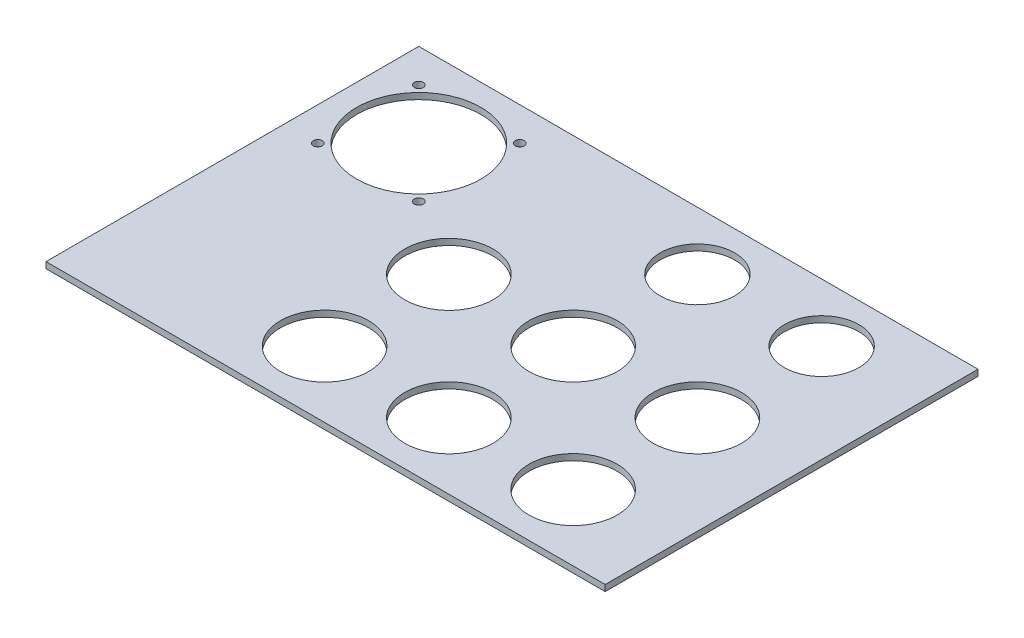
ISO-10303-21;
HEADER;
FILE_DESCRIPTION(('STEP AP214'),'2;1');
FILE_NAME('part.step','',(''),(''),'','','');
FILE_SCHEMA(('AUTOMOTIVE_DESIGN { 1 0 10303 214 1 1 1 1 }'));
ENDSEC;
DATA;
#1=APPLICATION_CONTEXT('core data for automotive mechanical design processes');
#2=APPLICATION_PROTOCOL_DEFINITION('international standard','automotive_design',2000,#1);
#3=PRODUCT_CONTEXT('',#1,'mechanical');
#4=PRODUCT('Part','Part','',(#3));
#5=PRODUCT_RELATED_PRODUCT_CATEGORY('part','',(#4));
#6=PRODUCT_DEFINITION_FORMATION('','',#4);
#7=PRODUCT_DEFINITION_CONTEXT('part definition',#1,'design');
#8=PRODUCT_DEFINITION('design','',#6,#7);
#9=PRODUCT_DEFINITION_SHAPE('','',#8);
#10=(LENGTH_UNIT() NAMED_UNIT(*) SI_UNIT(.MILLI.,.METRE.));
#11=(NAMED_UNIT(*) PLANE_ANGLE_UNIT() SI_UNIT($,.RADIAN.));
#12=(NAMED_UNIT(*) SI_UNIT($,.STERADIAN.) SOLID_ANGLE_UNIT());
#13=UNCERTAINTY_MEASURE_WITH_UNIT(LENGTH_MEASURE(1.E-05),#10,'distance_accuracy_value','');
#14=(GEOMETRIC_REPRESENTATION_CONTEXT(3) GLOBAL_UNCERTAINTY_ASSIGNED_CONTEXT((#13)) GLOBAL_UNIT_ASSIGNED_CONTEXT((#10,
#11,#12)) REPRESENTATION_CONTEXT('',''));
#15=CARTESIAN_POINT('',(0.,0.,0.));
#16=DIRECTION('',(0.,0.,1.));
#17=DIRECTION('',(1.,0.,0.));
#18=AXIS2_PLACEMENT_3D('',#15,#16,#17);
#19=CARTESIAN_POINT('',(-118.728476821192,2.,-78.6754966887417));
#20=DIRECTION('',(1.,0.,0.));
#21=DIRECTION('',(0.,0.,-1.));
#22=AXIS2_PLACEMENT_3D('',#19,#20,#21);
#23=PLANE('',#22);
#24=DIRECTION('',(0.,0.,1.));
#25=VECTOR('',#24,1.);
#26=CARTESIAN_POINT('',(-118.728476821192,0.,-78.6754966887417));
#27=LINE('',#26,#25);
#28=CARTESIAN_POINT('',(-118.728476821192,0.,-78.6754966887417));
#29=VERTEX_POINT('',#28);
#30=CARTESIAN_POINT('',(-118.728476821192,0.,41.3245033112583));
#31=VERTEX_POINT('',#30);
#32=EDGE_CURVE('E102',#29,#31,#27,.T.);
#33=ORIENTED_EDGE('',*,*,#32,.T.);
#34=DIRECTION('',(0.,-1.,0.));
#35=VECTOR('',#34,1.);
#36=CARTESIAN_POINT('',(-118.728476821192,2.,41.3245033112583));
#37=LINE('',#36,#35);
#38=CARTESIAN_POINT('',(-118.728476821192,2.,41.3245033112583));
#39=VERTEX_POINT('',#38);
#40=EDGE_CURVE('E11',#39,#31,#37,.T.);
#41=ORIENTED_EDGE('',*,*,#40,.F.);
#42=DIRECTION('',(0.,0.,1.));
#43=VECTOR('',#42,1.);
#44=CARTESIAN_POINT('',(-118.728476821192,2.,-78.6754966887417));
#45=LINE('',#44,#43);
#46=CARTESIAN_POINT('',(-118.728476821192,2.,-78.6754966887417));
#47=VERTEX_POINT('',#46);
#48=EDGE_CURVE('E90',#47,#39,#45,.T.);
#49=ORIENTED_EDGE('',*,*,#48,.F.);
#50=DIRECTION('',(0.,-1.,0.));
#51=VECTOR('',#50,1.);
#52=CARTESIAN_POINT('',(-118.728476821192,2.,-78.6754966887417));
#53=LINE('',#52,#51);
#54=EDGE_CURVE('E98',#47,#29,#53,.T.);
#55=ORIENTED_EDGE('',*,*,#54,.T.);
#56=EDGE_LOOP('',(#33,#41,#49,#55));
#57=FACE_BOUND('',#56,.T.);
#58=ADVANCED_FACE('F39',(#57),#23,.F.);
#59=CARTESIAN_POINT('',(-118.728476821192,2.,41.3245033112583));
#60=DIRECTION('',(0.,0.,-1.));
#61=DIRECTION('',(-1.,0.,0.));
#62=AXIS2_PLACEMENT_3D('',#59,#60,#61);
#63=PLANE('',#62);
#64=DIRECTION('',(1.,0.,0.));
#65=VECTOR('',#64,1.);
#66=CARTESIAN_POINT('',(-118.728476821192,0.,41.3245033112583));
#67=LINE('',#66,#65);
#68=CARTESIAN_POINT('',(61.2715231788079,0.,41.3245033112583));
#69=VERTEX_POINT('',#68);
#70=EDGE_CURVE('E94',#31,#69,#67,.T.);
#71=ORIENTED_EDGE('',*,*,#70,.T.);
#72=DIRECTION('',(0.,-1.,0.));
#73=VECTOR('',#72,1.);
#74=CARTESIAN_POINT('',(61.2715231788079,2.,41.3245033112583));
#75=LINE('',#74,#73);
#76=CARTESIAN_POINT('',(61.2715231788079,2.,41.3245033112583));
#77=VERTEX_POINT('',#76);
#78=EDGE_CURVE('E47',#77,#69,#75,.T.);
#79=ORIENTED_EDGE('',*,*,#78,.F.);
#80=DIRECTION('',(1.,0.,0.));
#81=VECTOR('',#80,1.);
#82=CARTESIAN_POINT('',(-118.728476821192,2.,41.3245033112583));
#83=LINE('',#82,#81);
#84=EDGE_CURVE('E85',#39,#77,#83,.T.);
#85=ORIENTED_EDGE('',*,*,#84,.F.);
#86=ORIENTED_EDGE('',*,*,#40,.T.);
#87=EDGE_LOOP('',(#71,#79,#85,#86));
#88=FACE_BOUND('',#87,.T.);
#89=ADVANCED_FACE('F93',(#88),#63,.F.);
#90=CARTESIAN_POINT('',(61.2715231788079,2.,-78.6754966887417));
#91=DIRECTION('',(-1.,0.,0.));
#92=DIRECTION('',(0.,0.,1.));
#93=AXIS2_PLACEMENT_3D('',#90,#91,#92);
#94=PLANE('',#93);
#95=DIRECTION('',(0.,0.,-1.));
#96=VECTOR('',#95,1.);
#97=CARTESIAN_POINT('',(61.2715231788079,0.,-78.6754966887417));
#98=LINE('',#97,#96);
#99=CARTESIAN_POINT('',(61.2715231788079,0.,-78.6754966887417));
#100=VERTEX_POINT('',#99);
#101=EDGE_CURVE('E72',#69,#100,#98,.T.);
#102=ORIENTED_EDGE('',*,*,#101,.T.);
#103=DIRECTION('',(0.,-1.,0.));
#104=VECTOR('',#103,1.);
#105=CARTESIAN_POINT('',(61.2715231788079,2.,-78.6754966887417));
#106=LINE('',#105,#104);
#107=CARTESIAN_POINT('',(61.2715231788079,2.,-78.6754966887417));
#108=VERTEX_POINT('',#107);
#109=EDGE_CURVE('E95',#108,#100,#106,.T.);
#110=ORIENTED_EDGE('',*,*,#109,.F.);
#111=DIRECTION('',(0.,0.,-1.));
#112=VECTOR('',#111,1.);
#113=CARTESIAN_POINT('',(61.2715231788079,2.,-78.6754966887417));
#114=LINE('',#113,#112);
#115=EDGE_CURVE('E88',#77,#108,#114,.T.);
#116=ORIENTED_EDGE('',*,*,#115,.F.);
#117=ORIENTED_EDGE('',*,*,#78,.T.);
#118=EDGE_LOOP('',(#102,#110,#116,#117));
#119=FACE_BOUND('',#118,.T.);
#120=ADVANCED_FACE('F96',(#119),#94,.F.);
#121=CARTESIAN_POINT('',(-118.728476821192,2.,-78.6754966887417));
#122=DIRECTION('',(0.,0.,1.));
#123=DIRECTION('',(1.,0.,0.));
#124=AXIS2_PLACEMENT_3D('',#121,#122,#123);
#125=PLANE('',#124);
#126=DIRECTION('',(-1.,0.,0.));
#127=VECTOR('',#126,1.);
#128=CARTESIAN_POINT('',(-118.728476821192,0.,-78.6754966887417));
#129=LINE('',#128,#127);
#130=EDGE_CURVE('E78',#100,#29,#129,.T.);
#131=ORIENTED_EDGE('',*,*,#130,.T.);
#132=ORIENTED_EDGE('',*,*,#54,.F.);
#133=DIRECTION('',(-1.,0.,0.));
#134=VECTOR('',#133,1.);
#135=CARTESIAN_POINT('',(-118.728476821192,2.,-78.6754966887417));
#136=LINE('',#135,#134);
#137=EDGE_CURVE('E55',#108,#47,#136,.T.);
#138=ORIENTED_EDGE('',*,*,#137,.F.);
#139=ORIENTED_EDGE('',*,*,#109,.T.);
#140=EDGE_LOOP('',(#131,#132,#138,#139));
#141=FACE_BOUND('',#140,.T.);
#142=ADVANCED_FACE('F110',(#141),#125,.F.);
#143=CARTESIAN_POINT('',(0.,2.,0.));
#144=DIRECTION('',(0.,1.,0.));
#145=DIRECTION('',(0.,0.,1.));
#146=AXIS2_PLACEMENT_3D('',#143,#144,#145);
#147=PLANE('',#146);
#148=CARTESIAN_POINT('',(-75.4784768211921,2.,-67.9254966887417));
#149=DIRECTION('',(0.,1.,0.));
#150=DIRECTION('',(0.,0.,1.));
#151=AXIS2_PLACEMENT_3D('',#148,#149,#150);
#152=CIRCLE('',#151,1.44999999999999);
#153=CARTESIAN_POINT('',(-75.4784768211921,2.,-66.4754966887417));
#154=VERTEX_POINT('',#153);
#155=EDGE_CURVE('E190',#154,#154,#152,.T.);
#156=ORIENTED_EDGE('',*,*,#155,.F.);
#157=EDGE_LOOP('',(#156));
#158=FACE_BOUND('',#157,.T.);
#159=CARTESIAN_POINT('',(-107.978476821192,2.,-67.9254966887417));
#160=DIRECTION('',(0.,1.,0.));
#161=DIRECTION('',(0.,0.,1.));
#162=AXIS2_PLACEMENT_3D('',#159,#160,#161);
#163=CIRCLE('',#162,1.44999999999999);
#164=CARTESIAN_POINT('',(-107.978476821192,2.,-66.4754966887417));
#165=VERTEX_POINT('',#164);
#166=EDGE_CURVE('E184',#165,#165,#163,.T.);
#167=ORIENTED_EDGE('',*,*,#166,.F.);
#168=EDGE_LOOP('',(#167));
#169=FACE_BOUND('',#168,.T.);
#170=CARTESIAN_POINT('',(-75.4784768211921,2.,-35.4254966887417));
#171=DIRECTION('',(0.,1.,0.));
#172=DIRECTION('',(0.,0.,1.));
#173=AXIS2_PLACEMENT_3D('',#170,#171,#172);
#174=CIRCLE('',#173,1.44999999999999);
#175=CARTESIAN_POINT('',(-75.4784768211921,2.,-33.9754966887417));
#176=VERTEX_POINT('',#175);
#177=EDGE_CURVE('E178',#176,#176,#174,.T.);
#178=ORIENTED_EDGE('',*,*,#177,.F.);
#179=EDGE_LOOP('',(#178));
#180=FACE_BOUND('',#179,.T.);
#181=CARTESIAN_POINT('',(-107.978476821192,2.,-35.4254966887417));
#182=DIRECTION('',(0.,1.,0.));
#183=DIRECTION('',(0.,0.,1.));
#184=AXIS2_PLACEMENT_3D('',#181,#182,#183);
#185=CIRCLE('',#184,1.44999999999999);
#186=CARTESIAN_POINT('',(-107.978476821192,2.,-33.9754966887417));
#187=VERTEX_POINT('',#186);
#188=EDGE_CURVE('E172',#187,#187,#185,.T.);
#189=ORIENTED_EDGE('',*,*,#188,.F.);
#190=EDGE_LOOP('',(#189));
#191=FACE_BOUND('',#190,.T.);
#192=CARTESIAN_POINT('',(-10.3380265351996,2.,-59.9586170489705));
#193=DIRECTION('',(0.,1.,0.));
#194=DIRECTION('',(0.,0.,1.));
#195=AXIS2_PLACEMENT_3D('',#192,#193,#194);
#196=CIRCLE('',#195,12.);
#197=CARTESIAN_POINT('',(-10.3380265351996,2.,-47.9586170489705));
#198=VERTEX_POINT('',#197);
#199=EDGE_CURVE('E121',#198,#198,#196,.T.);
#200=ORIENTED_EDGE('',*,*,#199,.F.);
#201=EDGE_LOOP('',(#200));
#202=FACE_BOUND('',#201,.T.);
#203=CARTESIAN_POINT('',(29.6619734648004,2.,-59.9586170489705));
#204=DIRECTION('',(0.,1.,0.));
#205=DIRECTION('',(0.,0.,1.));
#206=AXIS2_PLACEMENT_3D('',#203,#204,#205);
#207=CIRCLE('',#206,12.);
#208=CARTESIAN_POINT('',(29.6619734648004,2.,-47.9586170489705));
#209=VERTEX_POINT('',#208);
#210=EDGE_CURVE('E136',#209,#209,#207,.T.);
#211=ORIENTED_EDGE('',*,*,#210,.F.);
#212=EDGE_LOOP('',(#211));
#213=FACE_BOUND('',#212,.T.);
#214=CARTESIAN_POINT('',(-10.3380265351995,2.,20.0413829510295));
#215=DIRECTION('',(0.,1.,0.));
#216=DIRECTION('',(0.,0.,1.));
#217=AXIS2_PLACEMENT_3D('',#214,#215,#216);
#218=CIRCLE('',#217,14.2);
#219=CARTESIAN_POINT('',(-10.3380265351995,2.,34.2413829510295));
#220=VERTEX_POINT('',#219);
#221=EDGE_CURVE('E130',#220,#220,#218,.T.);
#222=ORIENTED_EDGE('',*,*,#221,.F.);
#223=EDGE_LOOP('',(#222));
#224=FACE_BOUND('',#223,.T.);
#225=CARTESIAN_POINT('',(29.6619734648005,2.,20.0413829510295));
#226=DIRECTION('',(0.,1.,0.));
#227=DIRECTION('',(0.,0.,1.));
#228=AXIS2_PLACEMENT_3D('',#225,#226,#227);
#229=CIRCLE('',#228,14.2);
#230=CARTESIAN_POINT('',(29.6619734648005,2.,34.2413829510295));
#231=VERTEX_POINT('',#230);
#232=EDGE_CURVE('E122',#231,#231,#229,.T.);
#233=ORIENTED_EDGE('',*,*,#232,.F.);
#234=EDGE_LOOP('',(#233));
#235=FACE_BOUND('',#234,.T.);
#236=CARTESIAN_POINT('',(-91.7284768211921,2.,-51.6754966887417));
#237=DIRECTION('',(0.,1.,0.));
#238=DIRECTION('',(0.,0.,1.));
#239=AXIS2_PLACEMENT_3D('',#236,#237,#238);
#240=CIRCLE('',#239,20.01);
#241=CARTESIAN_POINT('',(-91.7284768211921,2.,-31.6654966887417));
#242=VERTEX_POINT('',#241);
#243=EDGE_CURVE('E158',#242,#242,#240,.T.);
#244=ORIENTED_EDGE('',*,*,#243,.F.);
#245=EDGE_LOOP('',(#244));
#246=FACE_BOUND('',#245,.T.);
#247=CARTESIAN_POINT('',(29.6619734648004,2.,-19.9586170489705));
#248=DIRECTION('',(0.,1.,0.));
#249=DIRECTION('',(0.,0.,1.));
#250=AXIS2_PLACEMENT_3D('',#247,#248,#249);
#251=CIRCLE('',#250,14.2);
#252=CARTESIAN_POINT('',(29.6619734648004,2.,-5.75861704897052));
#253=VERTEX_POINT('',#252);
#254=EDGE_CURVE('E153',#253,#253,#251,.T.);
#255=ORIENTED_EDGE('',*,*,#254,.F.);
#256=EDGE_LOOP('',(#255));
#257=FACE_BOUND('',#256,.T.);
#258=CARTESIAN_POINT('',(-10.3380265351996,2.,-19.9586170489705));
#259=DIRECTION('',(0.,1.,0.));
#260=DIRECTION('',(0.,0.,1.));
#261=AXIS2_PLACEMENT_3D('',#258,#259,#260);
#262=CIRCLE('',#261,14.2);
#263=CARTESIAN_POINT('',(-10.3380265351996,2.,-5.75861704897051));
#264=VERTEX_POINT('',#263);
#265=EDGE_CURVE('E146',#264,#264,#262,.T.);
#266=ORIENTED_EDGE('',*,*,#265,.F.);
#267=EDGE_LOOP('',(#266));
#268=FACE_BOUND('',#267,.T.);
#269=CARTESIAN_POINT('',(-50.3380265351996,2.,-19.9586170489705));
#270=DIRECTION('',(0.,1.,0.));
#271=DIRECTION('',(0.,0.,1.));
#272=AXIS2_PLACEMENT_3D('',#269,#270,#271);
#273=CIRCLE('',#272,14.2);
#274=CARTESIAN_POINT('',(-50.3380265351996,2.,-5.75861704897051));
#275=VERTEX_POINT('',#274);
#276=EDGE_CURVE('E129',#275,#275,#273,.T.);
#277=ORIENTED_EDGE('',*,*,#276,.F.);
#278=EDGE_LOOP('',(#277));
#279=FACE_BOUND('',#278,.T.);
#280=CARTESIAN_POINT('',(-50.3380265351995,2.,20.0413829510295));
#281=DIRECTION('',(0.,1.,0.));
#282=DIRECTION('',(0.,0.,1.));
#283=AXIS2_PLACEMENT_3D('',#280,#281,#282);
#284=CIRCLE('',#283,14.2);
#285=CARTESIAN_POINT('',(-50.3380265351995,2.,34.2413829510295));
#286=VERTEX_POINT('',#285);
#287=EDGE_CURVE('E118',#286,#286,#284,.T.);
#288=ORIENTED_EDGE('',*,*,#287,.F.);
#289=EDGE_LOOP('',(#288));
#290=FACE_BOUND('',#289,.T.);
#291=ORIENTED_EDGE('',*,*,#48,.T.);
#292=ORIENTED_EDGE('',*,*,#84,.T.);
#293=ORIENTED_EDGE('',*,*,#115,.T.);
#294=ORIENTED_EDGE('',*,*,#137,.T.);
#295=EDGE_LOOP('',(#291,#292,#293,#294));
#296=FACE_BOUND('',#295,.T.);
#297=ADVANCED_FACE('F86',(#158,#169,#180,#191,#202,#213,#224,#235,#246,#257,#268,#279,#290,
#296),#147,.T.);
#298=CARTESIAN_POINT('',(0.,0.,0.));
#299=DIRECTION('',(0.,1.,0.));
#300=DIRECTION('',(0.,0.,1.));
#301=AXIS2_PLACEMENT_3D('',#298,#299,#300);
#302=PLANE('',#301);
#303=CARTESIAN_POINT('',(-75.4784768211921,0.,-67.9254966887417));
#304=DIRECTION('',(0.,1.,0.));
#305=DIRECTION('',(0.,0.,1.));
#306=AXIS2_PLACEMENT_3D('',#303,#304,#305);
#307=CIRCLE('',#306,1.44999999999999);
#308=CARTESIAN_POINT('',(-75.4784768211921,0.,-66.4754966887417));
#309=VERTEX_POINT('',#308);
#310=EDGE_CURVE('E187',#309,#309,#307,.T.);
#311=ORIENTED_EDGE('',*,*,#310,.T.);
#312=EDGE_LOOP('',(#311));
#313=FACE_BOUND('',#312,.T.);
#314=CARTESIAN_POINT('',(-107.978476821192,0.,-67.9254966887417));
#315=DIRECTION('',(0.,1.,0.));
#316=DIRECTION('',(0.,0.,1.));
#317=AXIS2_PLACEMENT_3D('',#314,#315,#316);
#318=CIRCLE('',#317,1.44999999999999);
#319=CARTESIAN_POINT('',(-107.978476821192,0.,-66.4754966887417));
#320=VERTEX_POINT('',#319);
#321=EDGE_CURVE('E181',#320,#320,#318,.T.);
#322=ORIENTED_EDGE('',*,*,#321,.T.);
#323=EDGE_LOOP('',(#322));
#324=FACE_BOUND('',#323,.T.);
#325=CARTESIAN_POINT('',(-75.4784768211921,0.,-35.4254966887417));
#326=DIRECTION('',(0.,1.,0.));
#327=DIRECTION('',(0.,0.,1.));
#328=AXIS2_PLACEMENT_3D('',#325,#326,#327);
#329=CIRCLE('',#328,1.44999999999999);
#330=CARTESIAN_POINT('',(-75.4784768211921,0.,-33.9754966887417));
#331=VERTEX_POINT('',#330);
#332=EDGE_CURVE('E175',#331,#331,#329,.T.);
#333=ORIENTED_EDGE('',*,*,#332,.T.);
#334=EDGE_LOOP('',(#333));
#335=FACE_BOUND('',#334,.T.);
#336=CARTESIAN_POINT('',(-107.978476821192,0.,-35.4254966887417));
#337=DIRECTION('',(0.,1.,0.));
#338=DIRECTION('',(0.,0.,1.));
#339=AXIS2_PLACEMENT_3D('',#336,#337,#338);
#340=CIRCLE('',#339,1.44999999999999);
#341=CARTESIAN_POINT('',(-107.978476821192,0.,-33.9754966887417));
#342=VERTEX_POINT('',#341);
#343=EDGE_CURVE('E165',#342,#342,#340,.T.);
#344=ORIENTED_EDGE('',*,*,#343,.T.);
#345=EDGE_LOOP('',(#344));
#346=FACE_BOUND('',#345,.T.);
#347=CARTESIAN_POINT('',(-10.3380265351996,0.,-59.9586170489705));
#348=DIRECTION('',(0.,1.,0.));
#349=DIRECTION('',(0.,0.,1.));
#350=AXIS2_PLACEMENT_3D('',#347,#348,#349);
#351=CIRCLE('',#350,12.);
#352=CARTESIAN_POINT('',(-10.3380265351996,0.,-47.9586170489705));
#353=VERTEX_POINT('',#352);
#354=EDGE_CURVE('E139',#353,#353,#351,.F.);
#355=ORIENTED_EDGE('',*,*,#354,.F.);
#356=EDGE_LOOP('',(#355));
#357=FACE_BOUND('',#356,.T.);
#358=CARTESIAN_POINT('',(29.6619734648004,0.,-59.9586170489705));
#359=DIRECTION('',(0.,1.,0.));
#360=DIRECTION('',(0.,0.,1.));
#361=AXIS2_PLACEMENT_3D('',#358,#359,#360);
#362=CIRCLE('',#361,12.);
#363=CARTESIAN_POINT('',(29.6619734648004,0.,-47.9586170489705));
#364=VERTEX_POINT('',#363);
#365=EDGE_CURVE('E133',#364,#364,#362,.F.);
#366=ORIENTED_EDGE('',*,*,#365,.F.);
#367=EDGE_LOOP('',(#366));
#368=FACE_BOUND('',#367,.T.);
#369=CARTESIAN_POINT('',(-10.3380265351995,0.,20.0413829510295));
#370=DIRECTION('',(0.,1.,0.));
#371=DIRECTION('',(0.,0.,1.));
#372=AXIS2_PLACEMENT_3D('',#369,#370,#371);
#373=CIRCLE('',#372,14.2);
#374=CARTESIAN_POINT('',(-10.3380265351995,0.,34.2413829510295));
#375=VERTEX_POINT('',#374);
#376=EDGE_CURVE('E125',#375,#375,#373,.F.);
#377=ORIENTED_EDGE('',*,*,#376,.F.);
#378=EDGE_LOOP('',(#377));
#379=FACE_BOUND('',#378,.T.);
#380=CARTESIAN_POINT('',(29.6619734648005,0.,20.0413829510295));
#381=DIRECTION('',(0.,1.,0.));
#382=DIRECTION('',(0.,0.,1.));
#383=AXIS2_PLACEMENT_3D('',#380,#381,#382);
#384=CIRCLE('',#383,14.2);
#385=CARTESIAN_POINT('',(29.6619734648005,0.,34.2413829510295));
#386=VERTEX_POINT('',#385);
#387=EDGE_CURVE('E126',#386,#386,#384,.F.);
#388=ORIENTED_EDGE('',*,*,#387,.F.);
#389=EDGE_LOOP('',(#388));
#390=FACE_BOUND('',#389,.T.);
#391=CARTESIAN_POINT('',(-91.7284768211921,0.,-51.6754966887417));
#392=DIRECTION('',(0.,1.,0.));
#393=DIRECTION('',(0.,0.,1.));
#394=AXIS2_PLACEMENT_3D('',#391,#392,#393);
#395=CIRCLE('',#394,20.01);
#396=CARTESIAN_POINT('',(-91.7284768211921,0.,-31.6654966887417));
#397=VERTEX_POINT('',#396);
#398=EDGE_CURVE('E162',#397,#397,#395,.F.);
#399=ORIENTED_EDGE('',*,*,#398,.F.);
#400=EDGE_LOOP('',(#399));
#401=FACE_BOUND('',#400,.T.);
#402=CARTESIAN_POINT('',(29.6619734648004,0.,-19.9586170489705));
#403=DIRECTION('',(0.,1.,0.));
#404=DIRECTION('',(0.,0.,1.));
#405=AXIS2_PLACEMENT_3D('',#402,#403,#404);
#406=CIRCLE('',#405,14.2);
#407=CARTESIAN_POINT('',(29.6619734648004,0.,-5.75861704897052));
#408=VERTEX_POINT('',#407);
#409=EDGE_CURVE('E161',#408,#408,#406,.F.);
#410=ORIENTED_EDGE('',*,*,#409,.F.);
#411=EDGE_LOOP('',(#410));
#412=FACE_BOUND('',#411,.T.);
#413=CARTESIAN_POINT('',(-10.3380265351996,0.,-19.9586170489705));
#414=DIRECTION('',(0.,1.,0.));
#415=DIRECTION('',(0.,0.,1.));
#416=AXIS2_PLACEMENT_3D('',#413,#414,#415);
#417=CIRCLE('',#416,14.2);
#418=CARTESIAN_POINT('',(-10.3380265351996,0.,-5.75861704897051));
#419=VERTEX_POINT('',#418);
#420=EDGE_CURVE('E150',#419,#419,#417,.F.);
#421=ORIENTED_EDGE('',*,*,#420,.F.);
#422=EDGE_LOOP('',(#421));
#423=FACE_BOUND('',#422,.T.);
#424=CARTESIAN_POINT('',(-50.3380265351996,0.,-19.9586170489705));
#425=DIRECTION('',(0.,1.,0.));
#426=DIRECTION('',(0.,0.,1.));
#427=AXIS2_PLACEMENT_3D('',#424,#425,#426);
#428=CIRCLE('',#427,14.2);
#429=CARTESIAN_POINT('',(-50.3380265351996,0.,-5.75861704897051));
#430=VERTEX_POINT('',#429);
#431=EDGE_CURVE('E149',#430,#430,#428,.F.);
#432=ORIENTED_EDGE('',*,*,#431,.F.);
#433=EDGE_LOOP('',(#432));
#434=FACE_BOUND('',#433,.T.);
#435=CARTESIAN_POINT('',(-50.3380265351995,0.,20.0413829510295));
#436=DIRECTION('',(0.,1.,0.));
#437=DIRECTION('',(0.,0.,1.));
#438=AXIS2_PLACEMENT_3D('',#435,#436,#437);
#439=CIRCLE('',#438,14.2);
#440=CARTESIAN_POINT('',(-50.3380265351995,0.,34.2413829510295));
#441=VERTEX_POINT('',#440);
#442=EDGE_CURVE('E105',#441,#441,#439,.F.);
#443=ORIENTED_EDGE('',*,*,#442,.F.);
#444=EDGE_LOOP('',(#443));
#445=FACE_BOUND('',#444,.T.);
#446=ORIENTED_EDGE('',*,*,#32,.F.);
#447=ORIENTED_EDGE('',*,*,#130,.F.);
#448=ORIENTED_EDGE('',*,*,#101,.F.);
#449=ORIENTED_EDGE('',*,*,#70,.F.);
#450=EDGE_LOOP('',(#446,#447,#448,#449));
#451=FACE_BOUND('',#450,.T.);
#452=ADVANCED_FACE('F113',(#313,#324,#335,#346,#357,#368,#379,#390,#401,#412,#423,#434,#445,
#451),#302,.F.);
#453=CARTESIAN_POINT('',(-50.3380265351995,-0.00100000000000013,20.0413829510295));
#454=DIRECTION('',(0.,1.,0.));
#455=DIRECTION('',(0.,0.,1.));
#456=AXIS2_PLACEMENT_3D('',#453,#454,#455);
#457=CYLINDRICAL_SURFACE('',#456,14.2);
#458=ORIENTED_EDGE('',*,*,#287,.T.);
#459=EDGE_LOOP('',(#458));
#460=FACE_BOUND('',#459,.T.);
#461=ORIENTED_EDGE('',*,*,#442,.T.);
#462=EDGE_LOOP('',(#461));
#463=FACE_BOUND('',#462,.T.);
#464=ADVANCED_FACE('F223',(#460,#463),#457,.F.);
#465=CARTESIAN_POINT('',(-50.3380265351996,-0.00100000000000013,-19.9586170489705));
#466=DIRECTION('',(0.,1.,0.));
#467=DIRECTION('',(0.,0.,1.));
#468=AXIS2_PLACEMENT_3D('',#465,#466,#467);
#469=CYLINDRICAL_SURFACE('',#468,14.2);
#470=ORIENTED_EDGE('',*,*,#276,.T.);
#471=EDGE_LOOP('',(#470));
#472=FACE_BOUND('',#471,.T.);
#473=ORIENTED_EDGE('',*,*,#431,.T.);
#474=EDGE_LOOP('',(#473));
#475=FACE_BOUND('',#474,.T.);
#476=ADVANCED_FACE('F226',(#472,#475),#469,.F.);
#477=CARTESIAN_POINT('',(-10.3380265351996,-0.00100000000000013,-19.9586170489705));
#478=DIRECTION('',(0.,1.,0.));
#479=DIRECTION('',(0.,0.,1.));
#480=AXIS2_PLACEMENT_3D('',#477,#478,#479);
#481=CYLINDRICAL_SURFACE('',#480,14.2);
#482=ORIENTED_EDGE('',*,*,#265,.T.);
#483=EDGE_LOOP('',(#482));
#484=FACE_BOUND('',#483,.T.);
#485=ORIENTED_EDGE('',*,*,#420,.T.);
#486=EDGE_LOOP('',(#485));
#487=FACE_BOUND('',#486,.T.);
#488=ADVANCED_FACE('F264',(#484,#487),#481,.F.);
#489=CARTESIAN_POINT('',(29.6619734648004,-0.00100000000000013,-19.9586170489705));
#490=DIRECTION('',(0.,1.,0.));
#491=DIRECTION('',(0.,0.,1.));
#492=AXIS2_PLACEMENT_3D('',#489,#490,#491);
#493=CYLINDRICAL_SURFACE('',#492,14.2);
#494=ORIENTED_EDGE('',*,*,#254,.T.);
#495=EDGE_LOOP('',(#494));
#496=FACE_BOUND('',#495,.T.);
#497=ORIENTED_EDGE('',*,*,#409,.T.);
#498=EDGE_LOOP('',(#497));
#499=FACE_BOUND('',#498,.T.);
#500=ADVANCED_FACE('F273',(#496,#499),#493,.F.);
#501=CARTESIAN_POINT('',(-91.7284768211921,-0.00100000000000013,-51.6754966887417));
#502=DIRECTION('',(0.,1.,0.));
#503=DIRECTION('',(0.,0.,1.));
#504=AXIS2_PLACEMENT_3D('',#501,#502,#503);
#505=CYLINDRICAL_SURFACE('',#504,20.01);
#506=ORIENTED_EDGE('',*,*,#243,.T.);
#507=EDGE_LOOP('',(#506));
#508=FACE_BOUND('',#507,.T.);
#509=ORIENTED_EDGE('',*,*,#398,.T.);
#510=EDGE_LOOP('',(#509));
#511=FACE_BOUND('',#510,.T.);
#512=ADVANCED_FACE('F282',(#508,#511),#505,.F.);
#513=CARTESIAN_POINT('',(29.6619734648005,-0.00100000000000013,20.0413829510295));
#514=DIRECTION('',(0.,1.,0.));
#515=DIRECTION('',(0.,0.,1.));
#516=AXIS2_PLACEMENT_3D('',#513,#514,#515);
#517=CYLINDRICAL_SURFACE('',#516,14.2);
#518=ORIENTED_EDGE('',*,*,#232,.T.);
#519=EDGE_LOOP('',(#518));
#520=FACE_BOUND('',#519,.T.);
#521=ORIENTED_EDGE('',*,*,#387,.T.);
#522=EDGE_LOOP('',(#521));
#523=FACE_BOUND('',#522,.T.);
#524=ADVANCED_FACE('F291',(#520,#523),#517,.F.);
#525=CARTESIAN_POINT('',(-10.3380265351995,-0.00100000000000013,20.0413829510295));
#526=DIRECTION('',(0.,1.,0.));
#527=DIRECTION('',(0.,0.,1.));
#528=AXIS2_PLACEMENT_3D('',#525,#526,#527);
#529=CYLINDRICAL_SURFACE('',#528,14.2);
#530=ORIENTED_EDGE('',*,*,#221,.T.);
#531=EDGE_LOOP('',(#530));
#532=FACE_BOUND('',#531,.T.);
#533=ORIENTED_EDGE('',*,*,#376,.T.);
#534=EDGE_LOOP('',(#533));
#535=FACE_BOUND('',#534,.T.);
#536=ADVANCED_FACE('F300',(#532,#535),#529,.F.);
#537=CARTESIAN_POINT('',(29.6619734648004,-0.00100000000000013,-59.9586170489705));
#538=DIRECTION('',(0.,1.,0.));
#539=DIRECTION('',(0.,0.,1.));
#540=AXIS2_PLACEMENT_3D('',#537,#538,#539);
#541=CYLINDRICAL_SURFACE('',#540,12.);
#542=ORIENTED_EDGE('',*,*,#210,.T.);
#543=EDGE_LOOP('',(#542));
#544=FACE_BOUND('',#543,.T.);
#545=ORIENTED_EDGE('',*,*,#365,.T.);
#546=EDGE_LOOP('',(#545));
#547=FACE_BOUND('',#546,.T.);
#548=ADVANCED_FACE('F309',(#544,#547),#541,.F.);
#549=CARTESIAN_POINT('',(-10.3380265351996,-0.00100000000000013,-59.9586170489705));
#550=DIRECTION('',(0.,1.,0.));
#551=DIRECTION('',(0.,0.,1.));
#552=AXIS2_PLACEMENT_3D('',#549,#550,#551);
#553=CYLINDRICAL_SURFACE('',#552,12.);
#554=ORIENTED_EDGE('',*,*,#199,.T.);
#555=EDGE_LOOP('',(#554));
#556=FACE_BOUND('',#555,.T.);
#557=ORIENTED_EDGE('',*,*,#354,.T.);
#558=EDGE_LOOP('',(#557));
#559=FACE_BOUND('',#558,.T.);
#560=ADVANCED_FACE('F318',(#556,#559),#553,.F.);
#561=CARTESIAN_POINT('',(-107.978476821192,2.,-35.4254966887417));
#562=DIRECTION('',(0.,1.,0.));
#563=DIRECTION('',(0.,0.,1.));
#564=AXIS2_PLACEMENT_3D('',#561,#562,#563);
#565=CYLINDRICAL_SURFACE('',#564,1.44999999999999);
#566=ORIENTED_EDGE('',*,*,#343,.F.);
#567=EDGE_LOOP('',(#566));
#568=FACE_BOUND('',#567,.T.);
#569=ORIENTED_EDGE('',*,*,#188,.T.);
#570=EDGE_LOOP('',(#569));
#571=FACE_BOUND('',#570,.T.);
#572=ADVANCED_FACE('F326',(#568,#571),#565,.F.);
#573=CARTESIAN_POINT('',(-75.4784768211921,2.,-35.4254966887417));
#574=DIRECTION('',(0.,1.,0.));
#575=DIRECTION('',(0.,0.,1.));
#576=AXIS2_PLACEMENT_3D('',#573,#574,#575);
#577=CYLINDRICAL_SURFACE('',#576,1.44999999999999);
#578=ORIENTED_EDGE('',*,*,#332,.F.);
#579=EDGE_LOOP('',(#578));
#580=FACE_BOUND('',#579,.T.);
#581=ORIENTED_EDGE('',*,*,#177,.T.);
#582=EDGE_LOOP('',(#581));
#583=FACE_BOUND('',#582,.T.);
#584=ADVANCED_FACE('F354',(#580,#583),#577,.F.);
#585=CARTESIAN_POINT('',(-107.978476821192,2.,-67.9254966887417));
#586=DIRECTION('',(0.,1.,0.));
#587=DIRECTION('',(0.,0.,1.));
#588=AXIS2_PLACEMENT_3D('',#585,#586,#587);
#589=CYLINDRICAL_SURFACE('',#588,1.44999999999999);
#590=ORIENTED_EDGE('',*,*,#321,.F.);
#591=EDGE_LOOP('',(#590));
#592=FACE_BOUND('',#591,.T.);
#593=ORIENTED_EDGE('',*,*,#166,.T.);
#594=EDGE_LOOP('',(#593));
#595=FACE_BOUND('',#594,.T.);
#596=ADVANCED_FACE('F363',(#592,#595),#589,.F.);
#597=CARTESIAN_POINT('',(-75.4784768211921,2.,-67.9254966887417));
#598=DIRECTION('',(0.,1.,0.));
#599=DIRECTION('',(0.,0.,1.));
#600=AXIS2_PLACEMENT_3D('',#597,#598,#599);
#601=CYLINDRICAL_SURFACE('',#600,1.44999999999999);
#602=ORIENTED_EDGE('',*,*,#310,.F.);
#603=EDGE_LOOP('',(#602));
#604=FACE_BOUND('',#603,.T.);
#605=ORIENTED_EDGE('',*,*,#155,.T.);
#606=EDGE_LOOP('',(#605));
#607=FACE_BOUND('',#606,.T.);
#608=ADVANCED_FACE('F194',(#604,#607),#601,.F.);
#609=CLOSED_SHELL('',(#58,#89,#120,#142,#297,#452,#464,#476,#488,#500,#512,#524,#536,#548,#560,
#572,#584,#596,#608));
#610=MANIFOLD_SOLID_BREP('B2',#609);
#611=ADVANCED_BREP_SHAPE_REPRESENTATION('',(#18,#610),#14);
#612=SHAPE_DEFINITION_REPRESENTATION(#9,#611);
ENDSEC;
END-ISO-10303-21;
